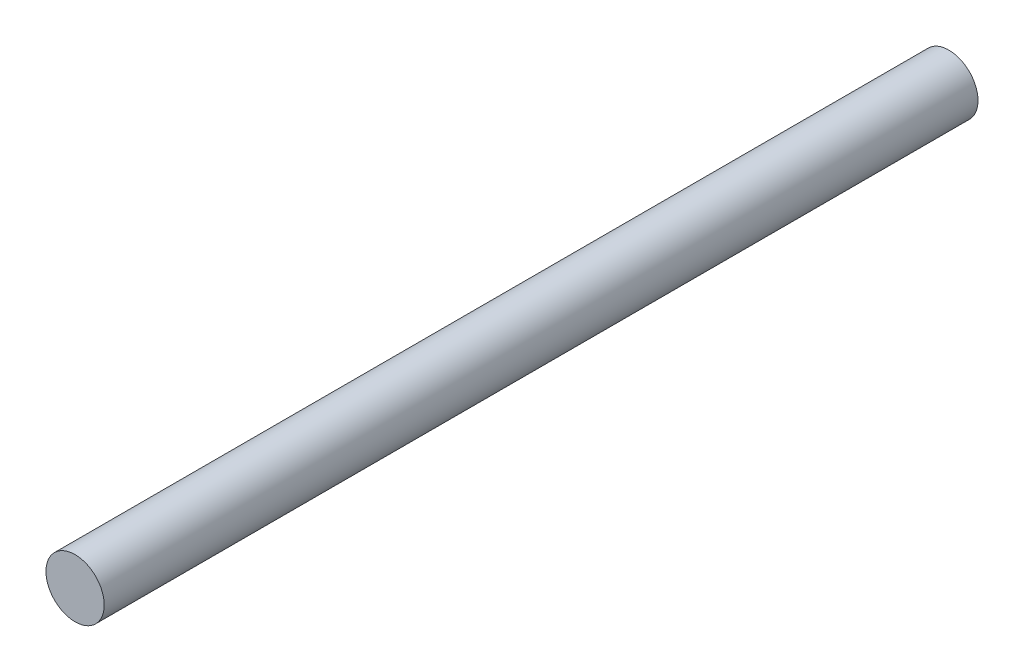
ISO-10303-21;
HEADER;
FILE_DESCRIPTION(('STEP AP214'),'2;1');
FILE_NAME('part.step','',(''),(''),'','','');
FILE_SCHEMA(('AUTOMOTIVE_DESIGN { 1 0 10303 214 1 1 1 1 }'));
ENDSEC;
DATA;
#1=APPLICATION_CONTEXT('core data for automotive mechanical design processes');
#2=APPLICATION_PROTOCOL_DEFINITION('international standard','automotive_design',2000,#1);
#3=PRODUCT_CONTEXT('',#1,'mechanical');
#4=PRODUCT('Part','Part','',(#3));
#5=PRODUCT_RELATED_PRODUCT_CATEGORY('part','',(#4));
#6=PRODUCT_DEFINITION_FORMATION('','',#4);
#7=PRODUCT_DEFINITION_CONTEXT('part definition',#1,'design');
#8=PRODUCT_DEFINITION('design','',#6,#7);
#9=PRODUCT_DEFINITION_SHAPE('','',#8);
#10=(LENGTH_UNIT() NAMED_UNIT(*) SI_UNIT(.MILLI.,.METRE.));
#11=(NAMED_UNIT(*) PLANE_ANGLE_UNIT() SI_UNIT($,.RADIAN.));
#12=(NAMED_UNIT(*) SI_UNIT($,.STERADIAN.) SOLID_ANGLE_UNIT());
#13=UNCERTAINTY_MEASURE_WITH_UNIT(LENGTH_MEASURE(1.E-05),#10,'distance_accuracy_value','');
#14=(GEOMETRIC_REPRESENTATION_CONTEXT(3) GLOBAL_UNCERTAINTY_ASSIGNED_CONTEXT((#13)) GLOBAL_UNIT_ASSIGNED_CONTEXT((#10,
#11,#12)) REPRESENTATION_CONTEXT('',''));
#15=CARTESIAN_POINT('',(0.,0.,0.));
#16=DIRECTION('',(0.,0.,1.));
#17=DIRECTION('',(1.,0.,0.));
#18=AXIS2_PLACEMENT_3D('',#15,#16,#17);
#19=CARTESIAN_POINT('',(0.,0.,120.));
#20=DIRECTION('',(0.,0.,-1.));
#21=DIRECTION('',(-1.,0.,0.));
#22=AXIS2_PLACEMENT_3D('',#19,#20,#21);
#23=CYLINDRICAL_SURFACE('',#22,4.);
#24=CARTESIAN_POINT('',(0.,0.,120.));
#25=DIRECTION('',(0.,0.,1.));
#26=DIRECTION('',(1.,0.,0.));
#27=AXIS2_PLACEMENT_3D('',#24,#25,#26);
#28=CIRCLE('',#27,4.);
#29=CARTESIAN_POINT('',(4.,0.,120.));
#30=VERTEX_POINT('',#29);
#31=EDGE_CURVE('E10',#30,#30,#28,.T.);
#32=ORIENTED_EDGE('',*,*,#31,.F.);
#33=EDGE_LOOP('',(#32));
#34=FACE_BOUND('',#33,.T.);
#35=CARTESIAN_POINT('',(0.,0.,0.));
#36=DIRECTION('',(0.,0.,1.));
#37=DIRECTION('',(1.,0.,0.));
#38=AXIS2_PLACEMENT_3D('',#35,#36,#37);
#39=CIRCLE('',#38,4.);
#40=CARTESIAN_POINT('',(4.,0.,0.));
#41=VERTEX_POINT('',#40);
#42=EDGE_CURVE('E34',#41,#41,#39,.T.);
#43=ORIENTED_EDGE('',*,*,#42,.T.);
#44=EDGE_LOOP('',(#43));
#45=FACE_BOUND('',#44,.T.);
#46=ADVANCED_FACE('F31',(#34,#45),#23,.T.);
#47=CARTESIAN_POINT('',(0.,0.,120.));
#48=DIRECTION('',(0.,0.,1.));
#49=DIRECTION('',(1.,0.,0.));
#50=AXIS2_PLACEMENT_3D('',#47,#48,#49);
#51=PLANE('',#50);
#52=ORIENTED_EDGE('',*,*,#31,.T.);
#53=EDGE_LOOP('',(#52));
#54=FACE_BOUND('',#53,.T.);
#55=ADVANCED_FACE('F46',(#54),#51,.T.);
#56=CARTESIAN_POINT('',(0.,0.,0.));
#57=DIRECTION('',(0.,0.,1.));
#58=DIRECTION('',(1.,0.,0.));
#59=AXIS2_PLACEMENT_3D('',#56,#57,#58);
#60=PLANE('',#59);
#61=ORIENTED_EDGE('',*,*,#42,.F.);
#62=EDGE_LOOP('',(#61));
#63=FACE_BOUND('',#62,.T.);
#64=ADVANCED_FACE('F44',(#63),#60,.F.);
#65=CLOSED_SHELL('',(#46,#55,#64));
#66=MANIFOLD_SOLID_BREP('B2',#65);
#67=ADVANCED_BREP_SHAPE_REPRESENTATION('',(#18,#66),#14);
#68=SHAPE_DEFINITION_REPRESENTATION(#9,#67);
ENDSEC;
END-ISO-10303-21;
